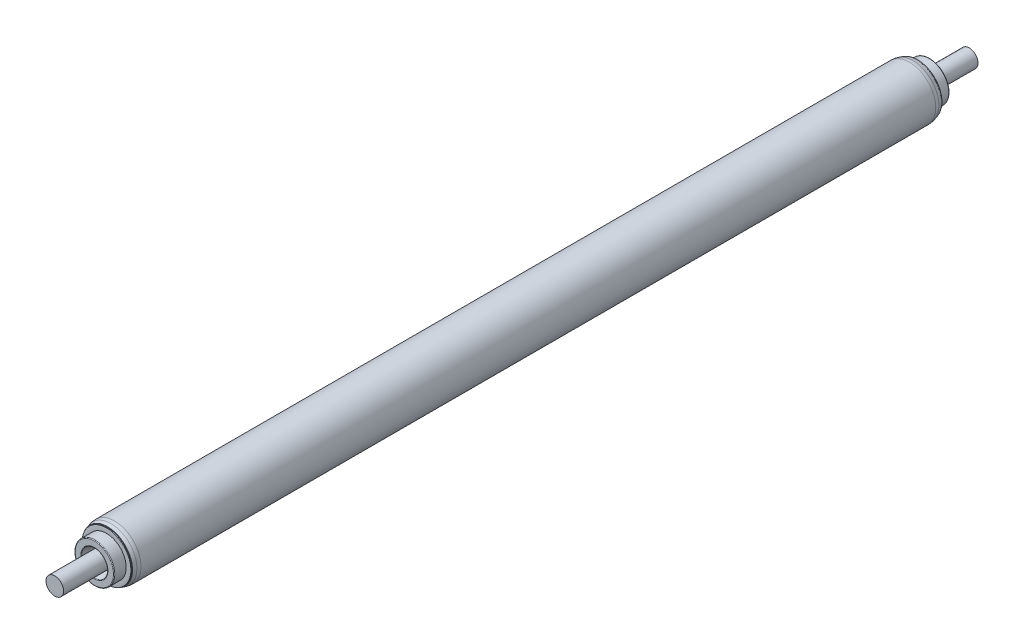
ISO-10303-21;
HEADER;
FILE_DESCRIPTION(('STEP AP214'),'2;1');
FILE_NAME('part.step','',(''),(''),'','','');
FILE_SCHEMA(('AUTOMOTIVE_DESIGN { 1 0 10303 214 1 1 1 1 }'));
ENDSEC;
DATA;
#1=APPLICATION_CONTEXT('core data for automotive mechanical design processes');
#2=APPLICATION_PROTOCOL_DEFINITION('international standard','automotive_design',2000,#1);
#3=PRODUCT_CONTEXT('',#1,'mechanical');
#4=PRODUCT('Part','Part','',(#3));
#5=PRODUCT_RELATED_PRODUCT_CATEGORY('part','',(#4));
#6=PRODUCT_DEFINITION_FORMATION('','',#4);
#7=PRODUCT_DEFINITION_CONTEXT('part definition',#1,'design');
#8=PRODUCT_DEFINITION('design','',#6,#7);
#9=PRODUCT_DEFINITION_SHAPE('','',#8);
#10=(LENGTH_UNIT() NAMED_UNIT(*) SI_UNIT(.MILLI.,.METRE.));
#11=(NAMED_UNIT(*) PLANE_ANGLE_UNIT() SI_UNIT($,.RADIAN.));
#12=(NAMED_UNIT(*) SI_UNIT($,.STERADIAN.) SOLID_ANGLE_UNIT());
#13=UNCERTAINTY_MEASURE_WITH_UNIT(LENGTH_MEASURE(1.E-05),#10,'distance_accuracy_value','');
#14=(GEOMETRIC_REPRESENTATION_CONTEXT(3) GLOBAL_UNCERTAINTY_ASSIGNED_CONTEXT((#13)) GLOBAL_UNIT_ASSIGNED_CONTEXT((#10,
#11,#12)) REPRESENTATION_CONTEXT('',''));
#15=CARTESIAN_POINT('',(0.,0.,0.));
#16=DIRECTION('',(0.,0.,1.));
#17=DIRECTION('',(1.,0.,0.));
#18=AXIS2_PLACEMENT_3D('',#15,#16,#17);
#19=CARTESIAN_POINT('',(0.,0.,-141.996100111103));
#20=DIRECTION('',(0.,0.,-1.));
#21=DIRECTION('',(1.,0.,0.));
#22=AXIS2_PLACEMENT_3D('',#19,#20,#21);
#23=TOROIDAL_SURFACE('',#22,4.42455553068771,2.53999999999998);
#24=CARTESIAN_POINT('',(0.,0.,-144.497511803754));
#25=DIRECTION('',(0.,0.,1.));
#26=DIRECTION('',(1.,0.,0.));
#27=AXIS2_PLACEMENT_3D('',#24,#25,#26);
#28=CIRCLE('',#27,4.86562190196167);
#29=CARTESIAN_POINT('',(4.86562190196167,0.,-144.497511803754));
#30=VERTEX_POINT('',#29);
#31=EDGE_CURVE('E64',#30,#30,#28,.T.);
#32=ORIENTED_EDGE('',*,*,#31,.F.);
#33=EDGE_LOOP('',(#32));
#34=FACE_BOUND('',#33,.T.);
#35=CARTESIAN_POINT('',(0.,0.,-143.266100111103));
#36=DIRECTION('',(0.,0.,1.));
#37=DIRECTION('',(1.,0.,0.));
#38=AXIS2_PLACEMENT_3D('',#35,#36,#37);
#39=CIRCLE('',#38,6.62426005630018);
#40=CARTESIAN_POINT('',(6.62426005630018,0.,-143.266100111103));
#41=VERTEX_POINT('',#40);
#42=EDGE_CURVE('E11',#41,#41,#39,.T.);
#43=ORIENTED_EDGE('',*,*,#42,.T.);
#44=EDGE_LOOP('',(#43));
#45=FACE_BOUND('',#44,.T.);
#46=ADVANCED_FACE('F50',(#34,#45),#23,.F.);
#47=CARTESIAN_POINT('',(0.,0.,-142.038561160277));
#48=DIRECTION('',(0.,0.,1.));
#49=DIRECTION('',(-1.,0.,0.));
#50=AXIS2_PLACEMENT_3D('',#47,#48,#49);
#51=CONICAL_SURFACE('',#50,7.33297999999998,0.523598775598313);
#52=ORIENTED_EDGE('',*,*,#42,.F.);
#53=EDGE_LOOP('',(#52));
#54=FACE_BOUND('',#53,.T.);
#55=CARTESIAN_POINT('',(0.,0.,-142.038561160277));
#56=DIRECTION('',(0.,0.,1.));
#57=DIRECTION('',(1.,0.,0.));
#58=AXIS2_PLACEMENT_3D('',#55,#56,#57);
#59=CIRCLE('',#58,7.33297999999998);
#60=CARTESIAN_POINT('',(7.33297999999998,0.,-142.038561160277));
#61=VERTEX_POINT('',#60);
#62=EDGE_CURVE('E56',#61,#61,#59,.T.);
#63=ORIENTED_EDGE('',*,*,#62,.T.);
#64=EDGE_LOOP('',(#63));
#65=FACE_BOUND('',#64,.T.);
#66=ADVANCED_FACE('F73',(#54,#65),#51,.F.);
#67=CARTESIAN_POINT('',(0.,0.,-152.4));
#68=DIRECTION('',(0.,0.,-1.));
#69=DIRECTION('',(1.,0.,0.));
#70=AXIS2_PLACEMENT_3D('',#67,#68,#69);
#71=CYLINDRICAL_SURFACE('',#70,7.33297999999998);
#72=ORIENTED_EDGE('',*,*,#62,.F.);
#73=EDGE_LOOP('',(#72));
#74=FACE_BOUND('',#73,.T.);
#75=CARTESIAN_POINT('',(0.,0.,-144.06245));
#76=DIRECTION('',(0.,0.,1.));
#77=DIRECTION('',(1.,0.,0.));
#78=AXIS2_PLACEMENT_3D('',#75,#76,#77);
#79=CIRCLE('',#78,7.33297999999998);
#80=CARTESIAN_POINT('',(7.33297999999998,0.,-144.06245));
#81=VERTEX_POINT('',#80);
#82=EDGE_CURVE('E60',#81,#81,#79,.T.);
#83=ORIENTED_EDGE('',*,*,#82,.T.);
#84=EDGE_LOOP('',(#83));
#85=FACE_BOUND('',#84,.T.);
#86=ADVANCED_FACE('F77',(#74,#85),#71,.T.);
#87=CARTESIAN_POINT('',(0.,0.,-144.497511803754));
#88=DIRECTION('',(0.,0.,1.));
#89=DIRECTION('',(-1.,0.,0.));
#90=AXIS2_PLACEMENT_3D('',#87,#88,#89);
#91=CONICAL_SURFACE('',#90,4.86562190196167,1.39626340159548);
#92=ORIENTED_EDGE('',*,*,#82,.F.);
#93=EDGE_LOOP('',(#92));
#94=FACE_BOUND('',#93,.T.);
#95=ORIENTED_EDGE('',*,*,#31,.T.);
#96=EDGE_LOOP('',(#95));
#97=FACE_BOUND('',#96,.T.);
#98=ADVANCED_FACE('F70',(#94,#97),#91,.T.);
#99=CLOSED_SHELL('',(#46,#66,#86,#98));
#100=MANIFOLD_SOLID_BREP('B2',#99);
#101=CARTESIAN_POINT('',(0.,0.,-136.296399999997));
#102=DIRECTION('',(0.,0.,-1.));
#103=DIRECTION('',(1.,0.,0.));
#104=AXIS2_PLACEMENT_3D('',#101,#102,#103);
#105=DEGENERATE_TOROIDAL_SURFACE('',#104,7.80097525196283,10.1854000000028,.T.);
#106=CARTESIAN_POINT('',(0.,0.,-146.431));
#107=DIRECTION('',(0.,0.,1.));
#108=DIRECTION('',(1.,0.,0.));
#109=AXIS2_PLACEMENT_3D('',#106,#107,#108);
#110=CIRCLE('',#109,6.78497525196296);
#111=CARTESIAN_POINT('',(6.78497525196296,0.,-146.431));
#112=VERTEX_POINT('',#111);
#113=EDGE_CURVE('E49',#112,#112,#110,.T.);
#114=ORIENTED_EDGE('',*,*,#113,.T.);
#115=EDGE_LOOP('',(#114));
#116=FACE_BOUND('',#115,.T.);
#117=CARTESIAN_POINT('',(0.,0.,-146.431));
#118=DIRECTION('',(0.,0.,1.));
#119=DIRECTION('',(1.,0.,0.));
#120=AXIS2_PLACEMENT_3D('',#117,#118,#119);
#121=CIRCLE('',#120,8.81697525196297);
#122=CARTESIAN_POINT('',(8.81697525196297,0.,-146.431));
#123=VERTEX_POINT('',#122);
#124=EDGE_CURVE('E159',#123,#123,#121,.T.);
#125=ORIENTED_EDGE('',*,*,#124,.F.);
#126=EDGE_LOOP('',(#125));
#127=FACE_BOUND('',#126,.T.);
#128=ADVANCED_FACE('F128',(#116,#127),#105,.T.);
#129=CARTESIAN_POINT('',(0.,0.,-144.239356490816));
#130=DIRECTION('',(0.,0.,-1.));
#131=DIRECTION('',(1.,0.,0.));
#132=AXIS2_PLACEMENT_3D('',#129,#130,#131);
#133=TOROIDAL_SURFACE('',#132,5.5011143838584,2.54);
#134=CARTESIAN_POINT('',(0.,0.,-143.798290119542));
#135=DIRECTION('',(0.,0.,1.));
#136=DIRECTION('',(1.,0.,0.));
#137=AXIS2_PLACEMENT_3D('',#134,#135,#136);
#138=CIRCLE('',#137,8.0025260765094);
#139=CARTESIAN_POINT('',(8.0025260765094,0.,-143.798290119542));
#140=VERTEX_POINT('',#139);
#141=EDGE_CURVE('E134',#140,#140,#138,.T.);
#142=ORIENTED_EDGE('',*,*,#141,.T.);
#143=EDGE_LOOP('',(#142));
#144=FACE_BOUND('',#143,.T.);
#145=ORIENTED_EDGE('',*,*,#113,.F.);
#146=EDGE_LOOP('',(#145));
#147=FACE_BOUND('',#146,.T.);
#148=ADVANCED_FACE('F167',(#144,#147),#133,.F.);
#149=CARTESIAN_POINT('',(0.,0.,-143.798290119542));
#150=DIRECTION('',(0.,0.,-1.));
#151=DIRECTION('',(1.,0.,0.));
#152=AXIS2_PLACEMENT_3D('',#149,#150,#151);
#153=CONICAL_SURFACE('',#152,8.0025260765094,0.174532925199429);
#154=CARTESIAN_POINT('',(0.,0.,-141.6939));
#155=DIRECTION('',(0.,0.,1.));
#156=DIRECTION('',(1.,0.,0.));
#157=AXIS2_PLACEMENT_3D('',#154,#155,#156);
#158=CIRCLE('',#157,7.6314653204979);
#159=CARTESIAN_POINT('',(7.6314653204979,0.,-141.6939));
#160=VERTEX_POINT('',#159);
#161=EDGE_CURVE('E138',#160,#160,#158,.T.);
#162=ORIENTED_EDGE('',*,*,#161,.T.);
#163=EDGE_LOOP('',(#162));
#164=FACE_BOUND('',#163,.T.);
#165=ORIENTED_EDGE('',*,*,#141,.F.);
#166=EDGE_LOOP('',(#165));
#167=FACE_BOUND('',#166,.T.);
#168=ADVANCED_FACE('F171',(#164,#167),#153,.F.);
#169=CARTESIAN_POINT('',(0.,7.63146532049791,-141.6939));
#170=DIRECTION('',(0.,0.,1.));
#171=DIRECTION('',(-1.,0.,0.));
#172=AXIS2_PLACEMENT_3D('',#169,#170,#171);
#173=PLANE('',#172);
#174=CARTESIAN_POINT('',(0.,0.,-141.6939));
#175=DIRECTION('',(0.,0.,1.));
#176=DIRECTION('',(1.,0.,0.));
#177=AXIS2_PLACEMENT_3D('',#174,#175,#176);
#178=CIRCLE('',#177,7.14247999999998);
#179=CARTESIAN_POINT('',(7.14247999999998,0.,-141.6939));
#180=VERTEX_POINT('',#179);
#181=EDGE_CURVE('E142',#180,#180,#178,.T.);
#182=ORIENTED_EDGE('',*,*,#181,.T.);
#183=EDGE_LOOP('',(#182));
#184=FACE_BOUND('',#183,.T.);
#185=ORIENTED_EDGE('',*,*,#161,.F.);
#186=EDGE_LOOP('',(#185));
#187=FACE_BOUND('',#186,.T.);
#188=ADVANCED_FACE('F175',(#184,#187),#173,.F.);
#189=CARTESIAN_POINT('',(0.,0.,-152.4));
#190=DIRECTION('',(0.,0.,-1.));
#191=DIRECTION('',(1.,0.,0.));
#192=AXIS2_PLACEMENT_3D('',#189,#190,#191);
#193=CYLINDRICAL_SURFACE('',#192,7.14247999999998);
#194=CARTESIAN_POINT('',(0.,0.,-140.0175));
#195=DIRECTION('',(0.,0.,1.));
#196=DIRECTION('',(1.,0.,0.));
#197=AXIS2_PLACEMENT_3D('',#194,#195,#196);
#198=CIRCLE('',#197,7.14247999999998);
#199=CARTESIAN_POINT('',(7.14247999999998,0.,-140.0175));
#200=VERTEX_POINT('',#199);
#201=EDGE_CURVE('E147',#200,#200,#198,.T.);
#202=ORIENTED_EDGE('',*,*,#201,.T.);
#203=EDGE_LOOP('',(#202));
#204=FACE_BOUND('',#203,.T.);
#205=ORIENTED_EDGE('',*,*,#181,.F.);
#206=EDGE_LOOP('',(#205));
#207=FACE_BOUND('',#206,.T.);
#208=ADVANCED_FACE('F182',(#204,#207),#193,.F.);
#209=CARTESIAN_POINT('',(0.,7.72274830916671,-140.0175));
#210=DIRECTION('',(0.,0.,-1.));
#211=DIRECTION('',(1.,0.,0.));
#212=AXIS2_PLACEMENT_3D('',#209,#210,#211);
#213=PLANE('',#212);
#214=CARTESIAN_POINT('',(0.,0.,-140.0175));
#215=DIRECTION('',(0.,0.,1.));
#216=DIRECTION('',(1.,0.,0.));
#217=AXIS2_PLACEMENT_3D('',#214,#215,#216);
#218=CIRCLE('',#217,7.7227483091667);
#219=CARTESIAN_POINT('',(7.7227483091667,0.,-140.0175));
#220=VERTEX_POINT('',#219);
#221=EDGE_CURVE('E150',#220,#220,#218,.T.);
#222=ORIENTED_EDGE('',*,*,#221,.T.);
#223=EDGE_LOOP('',(#222));
#224=FACE_BOUND('',#223,.T.);
#225=ORIENTED_EDGE('',*,*,#201,.F.);
#226=EDGE_LOOP('',(#225));
#227=FACE_BOUND('',#226,.T.);
#228=ADVANCED_FACE('F186',(#224,#227),#213,.F.);
#229=CARTESIAN_POINT('',(0.,0.,-140.0175));
#230=DIRECTION('',(0.,0.,-1.));
#231=DIRECTION('',(1.,0.,0.));
#232=AXIS2_PLACEMENT_3D('',#229,#230,#231);
#233=CONICAL_SURFACE('',#232,7.7227483091667,0.174532925199432);
#234=CARTESIAN_POINT('',(0.,0.,-146.177));
#235=DIRECTION('',(0.,0.,1.));
#236=DIRECTION('',(1.,0.,0.));
#237=AXIS2_PLACEMENT_3D('',#234,#235,#236);
#238=CIRCLE('',#237,8.80883434684047);
#239=CARTESIAN_POINT('',(8.80883434684047,0.,-146.177));
#240=VERTEX_POINT('',#239);
#241=EDGE_CURVE('E153',#240,#240,#238,.T.);
#242=ORIENTED_EDGE('',*,*,#241,.T.);
#243=EDGE_LOOP('',(#242));
#244=FACE_BOUND('',#243,.T.);
#245=ORIENTED_EDGE('',*,*,#221,.F.);
#246=EDGE_LOOP('',(#245));
#247=FACE_BOUND('',#246,.T.);
#248=ADVANCED_FACE('F190',(#244,#247),#233,.T.);
#249=CARTESIAN_POINT('',(0.,8.80883434684048,-146.177));
#250=DIRECTION('',(0.,0.,-1.));
#251=DIRECTION('',(1.,0.,0.));
#252=AXIS2_PLACEMENT_3D('',#249,#250,#251);
#253=PLANE('',#252);
#254=CARTESIAN_POINT('',(0.,0.,-146.177));
#255=DIRECTION('',(0.,0.,1.));
#256=DIRECTION('',(1.,0.,0.));
#257=AXIS2_PLACEMENT_3D('',#254,#255,#256);
#258=CIRCLE('',#257,8.88503434684048);
#259=CARTESIAN_POINT('',(8.88503434684048,0.,-146.177));
#260=VERTEX_POINT('',#259);
#261=EDGE_CURVE('E156',#260,#260,#258,.T.);
#262=ORIENTED_EDGE('',*,*,#261,.T.);
#263=EDGE_LOOP('',(#262));
#264=FACE_BOUND('',#263,.T.);
#265=ORIENTED_EDGE('',*,*,#241,.F.);
#266=EDGE_LOOP('',(#265));
#267=FACE_BOUND('',#266,.T.);
#268=ADVANCED_FACE('F194',(#264,#267),#253,.F.);
#269=CARTESIAN_POINT('',(0.,0.,-146.177));
#270=DIRECTION('',(0.,0.,1.));
#271=DIRECTION('',(-1.,0.,0.));
#272=AXIS2_PLACEMENT_3D('',#269,#270,#271);
#273=CONICAL_SURFACE('',#272,8.88503434684048,0.261799387799154);
#274=ORIENTED_EDGE('',*,*,#124,.T.);
#275=EDGE_LOOP('',(#274));
#276=FACE_BOUND('',#275,.T.);
#277=ORIENTED_EDGE('',*,*,#261,.F.);
#278=EDGE_LOOP('',(#277));
#279=FACE_BOUND('',#278,.T.);
#280=ADVANCED_FACE('F163',(#276,#279),#273,.T.);
#281=CLOSED_SHELL('',(#128,#148,#168,#188,#208,#228,#248,#268,#280));
#282=MANIFOLD_SOLID_BREP('B6',#281);
#283=CARTESIAN_POINT('',(0.,-3.17499999999999,-138.1125));
#284=DIRECTION('',(0.,0.,1.));
#285=DIRECTION('',(0.,1.,0.));
#286=AXIS2_PLACEMENT_3D('',#283,#284,#285);
#287=PLANE('',#286);
#288=CARTESIAN_POINT('',(0.,0.,-138.1125));
#289=DIRECTION('',(0.,0.,1.));
#290=DIRECTION('',(0.,-1.,0.));
#291=AXIS2_PLACEMENT_3D('',#288,#289,#290);
#292=CIRCLE('',#291,3.17499999999999);
#293=CARTESIAN_POINT('',(0.,-3.17499999999999,-138.1125));
#294=VERTEX_POINT('',#293);
#295=EDGE_CURVE('E316',#294,#294,#292,.T.);
#296=ORIENTED_EDGE('',*,*,#295,.F.);
#297=EDGE_LOOP('',(#296));
#298=FACE_BOUND('',#297,.T.);
#299=CARTESIAN_POINT('',(0.,0.,-138.1125));
#300=DIRECTION('',(0.,0.,1.));
#301=DIRECTION('',(0.,-1.,0.));
#302=AXIS2_PLACEMENT_3D('',#299,#300,#301);
#303=CIRCLE('',#302,7.14247999999998);
#304=CARTESIAN_POINT('',(0.,-7.14247999999997,-138.1125));
#305=VERTEX_POINT('',#304);
#306=EDGE_CURVE('E127',#305,#305,#303,.T.);
#307=ORIENTED_EDGE('',*,*,#306,.T.);
#308=EDGE_LOOP('',(#307));
#309=FACE_BOUND('',#308,.T.);
#310=ADVANCED_FACE('F291',(#298,#309),#287,.T.);
#311=CARTESIAN_POINT('',(0.,0.,-165.1));
#312=DIRECTION('',(0.,0.,-1.));
#313=DIRECTION('',(0.,-1.,0.));
#314=AXIS2_PLACEMENT_3D('',#311,#312,#313);
#315=CYLINDRICAL_SURFACE('',#314,7.14247999999998);
#316=ORIENTED_EDGE('',*,*,#306,.F.);
#317=EDGE_LOOP('',(#316));
#318=FACE_BOUND('',#317,.T.);
#319=CARTESIAN_POINT('',(0.,0.,-150.5585));
#320=DIRECTION('',(0.,0.,1.));
#321=DIRECTION('',(0.,-1.,0.));
#322=AXIS2_PLACEMENT_3D('',#319,#320,#321);
#323=CIRCLE('',#322,7.14247999999998);
#324=CARTESIAN_POINT('',(0.,-7.14247999999997,-150.5585));
#325=VERTEX_POINT('',#324);
#326=EDGE_CURVE('E297',#325,#325,#323,.T.);
#327=ORIENTED_EDGE('',*,*,#326,.T.);
#328=EDGE_LOOP('',(#327));
#329=FACE_BOUND('',#328,.T.);
#330=ADVANCED_FACE('F323',(#318,#329),#315,.T.);
#331=CARTESIAN_POINT('',(0.,0.,-150.5585));
#332=DIRECTION('',(0.,0.,-1.));
#333=DIRECTION('',(0.,-1.,0.));
#334=AXIS2_PLACEMENT_3D('',#331,#332,#333);
#335=TOROIDAL_SURFACE('',#334,6.88847999999998,0.254000000000002);
#336=ORIENTED_EDGE('',*,*,#326,.F.);
#337=EDGE_LOOP('',(#336));
#338=FACE_BOUND('',#337,.T.);
#339=CARTESIAN_POINT('',(0.,0.,-150.8125));
#340=DIRECTION('',(0.,0.,1.));
#341=DIRECTION('',(0.,-1.,0.));
#342=AXIS2_PLACEMENT_3D('',#339,#340,#341);
#343=CIRCLE('',#342,6.88847999999998);
#344=CARTESIAN_POINT('',(0.,-6.88847999999997,-150.8125));
#345=VERTEX_POINT('',#344);
#346=EDGE_CURVE('E301',#345,#345,#343,.T.);
#347=ORIENTED_EDGE('',*,*,#346,.T.);
#348=EDGE_LOOP('',(#347));
#349=FACE_BOUND('',#348,.T.);
#350=ADVANCED_FACE('F327',(#338,#349),#335,.T.);
#351=CARTESIAN_POINT('',(0.,-6.88847999999997,-150.8125));
#352=DIRECTION('',(0.,0.,-1.));
#353=DIRECTION('',(0.,-1.,0.));
#354=AXIS2_PLACEMENT_3D('',#351,#352,#353);
#355=PLANE('',#354);
#356=ORIENTED_EDGE('',*,*,#346,.F.);
#357=EDGE_LOOP('',(#356));
#358=FACE_BOUND('',#357,.T.);
#359=CARTESIAN_POINT('',(0.,0.,-150.8125));
#360=DIRECTION('',(0.,0.,1.));
#361=DIRECTION('',(0.,-1.,0.));
#362=AXIS2_PLACEMENT_3D('',#359,#360,#361);
#363=CIRCLE('',#362,4.91588804801143);
#364=CARTESIAN_POINT('',(0.,-4.91588804801142,-150.8125));
#365=VERTEX_POINT('',#364);
#366=EDGE_CURVE('E305',#365,#365,#363,.T.);
#367=ORIENTED_EDGE('',*,*,#366,.T.);
#368=EDGE_LOOP('',(#367));
#369=FACE_BOUND('',#368,.T.);
#370=ADVANCED_FACE('F332',(#358,#369),#355,.T.);
#371=CARTESIAN_POINT('',(0.,0.,-150.5585));
#372=DIRECTION('',(0.,0.,-1.));
#373=DIRECTION('',(0.,-1.,0.));
#374=AXIS2_PLACEMENT_3D('',#371,#372,#373);
#375=TOROIDAL_SURFACE('',#374,4.91588804801143,0.254000000000029);
#376=ORIENTED_EDGE('',*,*,#366,.F.);
#377=EDGE_LOOP('',(#376));
#378=FACE_BOUND('',#377,.T.);
#379=CARTESIAN_POINT('',(0.,0.,-150.675449640288));
#380=DIRECTION('',(0.,0.,1.));
#381=DIRECTION('',(0.,-1.,0.));
#382=AXIS2_PLACEMENT_3D('',#379,#380,#381);
#383=CIRCLE('',#382,4.69041347818909);
#384=CARTESIAN_POINT('',(0.,-4.69041347818908,-150.675449640288));
#385=VERTEX_POINT('',#384);
#386=EDGE_CURVE('E310',#385,#385,#383,.T.);
#387=ORIENTED_EDGE('',*,*,#386,.T.);
#388=EDGE_LOOP('',(#387));
#389=FACE_BOUND('',#388,.T.);
#390=ADVANCED_FACE('F338',(#378,#389),#375,.T.);
#391=CARTESIAN_POINT('',(0.,0.,-144.4625));
#392=DIRECTION('',(0.,0.,-1.));
#393=DIRECTION('',(0.,-1.,0.));
#394=AXIS2_PLACEMENT_3D('',#391,#392,#393);
#395=TOROIDAL_SURFACE('',#394,16.66875,13.49375);
#396=ORIENTED_EDGE('',*,*,#386,.F.);
#397=EDGE_LOOP('',(#396));
#398=FACE_BOUND('',#397,.T.);
#399=CARTESIAN_POINT('',(0.,0.,-144.4625));
#400=DIRECTION('',(0.,0.,1.));
#401=DIRECTION('',(0.,-1.,0.));
#402=AXIS2_PLACEMENT_3D('',#399,#400,#401);
#403=CIRCLE('',#402,3.17499999999999);
#404=CARTESIAN_POINT('',(0.,-3.17499999999998,-144.4625));
#405=VERTEX_POINT('',#404);
#406=EDGE_CURVE('E313',#405,#405,#403,.T.);
#407=ORIENTED_EDGE('',*,*,#406,.T.);
#408=EDGE_LOOP('',(#407));
#409=FACE_BOUND('',#408,.T.);
#410=ADVANCED_FACE('F342',(#398,#409),#395,.T.);
#411=CARTESIAN_POINT('',(0.,0.,-165.1));
#412=DIRECTION('',(0.,0.,-1.));
#413=DIRECTION('',(0.,-1.,0.));
#414=AXIS2_PLACEMENT_3D('',#411,#412,#413);
#415=CYLINDRICAL_SURFACE('',#414,3.17499999999999);
#416=ORIENTED_EDGE('',*,*,#406,.F.);
#417=EDGE_LOOP('',(#416));
#418=FACE_BOUND('',#417,.T.);
#419=ORIENTED_EDGE('',*,*,#295,.T.);
#420=EDGE_LOOP('',(#419));
#421=FACE_BOUND('',#420,.T.);
#422=ADVANCED_FACE('F320',(#418,#421),#415,.F.);
#423=CLOSED_SHELL('',(#310,#330,#350,#370,#390,#410,#422));
#424=MANIFOLD_SOLID_BREP('B44',#423);
#425=CARTESIAN_POINT('',(0.,0.,141.996100111103));
#426=DIRECTION('',(0.,0.,1.));
#427=DIRECTION('',(1.,0.,0.));
#428=AXIS2_PLACEMENT_3D('',#425,#426,#427);
#429=TOROIDAL_SURFACE('',#428,4.42455553068771,2.53999999999998);
#430=CARTESIAN_POINT('',(0.,0.,144.497511803754));
#431=DIRECTION('',(0.,0.,1.));
#432=DIRECTION('',(1.,0.,0.));
#433=AXIS2_PLACEMENT_3D('',#430,#431,#432);
#434=CIRCLE('',#433,4.86562190196167);
#435=CARTESIAN_POINT('',(4.86562190196167,0.,144.497511803754));
#436=VERTEX_POINT('',#435);
#437=EDGE_CURVE('E434',#436,#436,#434,.T.);
#438=ORIENTED_EDGE('',*,*,#437,.T.);
#439=EDGE_LOOP('',(#438));
#440=FACE_BOUND('',#439,.T.);
#441=CARTESIAN_POINT('',(0.,0.,143.266100111103));
#442=DIRECTION('',(0.,0.,1.));
#443=DIRECTION('',(1.,0.,0.));
#444=AXIS2_PLACEMENT_3D('',#441,#442,#443);
#445=CIRCLE('',#444,6.62426005630018);
#446=CARTESIAN_POINT('',(6.62426005630018,0.,143.266100111103));
#447=VERTEX_POINT('',#446);
#448=EDGE_CURVE('E290',#447,#447,#445,.T.);
#449=ORIENTED_EDGE('',*,*,#448,.F.);
#450=EDGE_LOOP('',(#449));
#451=FACE_BOUND('',#450,.T.);
#452=ADVANCED_FACE('F420',(#440,#451),#429,.F.);
#453=CARTESIAN_POINT('',(0.,0.,142.038561160277));
#454=DIRECTION('',(0.,0.,-1.));
#455=DIRECTION('',(-1.,0.,0.));
#456=AXIS2_PLACEMENT_3D('',#453,#454,#455);
#457=CONICAL_SURFACE('',#456,7.33297999999998,0.523598775598313);
#458=ORIENTED_EDGE('',*,*,#448,.T.);
#459=EDGE_LOOP('',(#458));
#460=FACE_BOUND('',#459,.T.);
#461=CARTESIAN_POINT('',(0.,0.,142.038561160277));
#462=DIRECTION('',(0.,0.,1.));
#463=DIRECTION('',(1.,0.,0.));
#464=AXIS2_PLACEMENT_3D('',#461,#462,#463);
#465=CIRCLE('',#464,7.33297999999998);
#466=CARTESIAN_POINT('',(7.33297999999998,0.,142.038561160277));
#467=VERTEX_POINT('',#466);
#468=EDGE_CURVE('E426',#467,#467,#465,.T.);
#469=ORIENTED_EDGE('',*,*,#468,.F.);
#470=EDGE_LOOP('',(#469));
#471=FACE_BOUND('',#470,.T.);
#472=ADVANCED_FACE('F450',(#460,#471),#457,.F.);
#473=CARTESIAN_POINT('',(0.,0.,152.4));
#474=DIRECTION('',(0.,0.,1.));
#475=DIRECTION('',(1.,0.,0.));
#476=AXIS2_PLACEMENT_3D('',#473,#474,#475);
#477=CYLINDRICAL_SURFACE('',#476,7.33297999999998);
#478=ORIENTED_EDGE('',*,*,#468,.T.);
#479=EDGE_LOOP('',(#478));
#480=FACE_BOUND('',#479,.T.);
#481=CARTESIAN_POINT('',(0.,0.,144.06245));
#482=DIRECTION('',(0.,0.,1.));
#483=DIRECTION('',(1.,0.,0.));
#484=AXIS2_PLACEMENT_3D('',#481,#482,#483);
#485=CIRCLE('',#484,7.33297999999998);
#486=CARTESIAN_POINT('',(7.33297999999998,0.,144.06245));
#487=VERTEX_POINT('',#486);
#488=EDGE_CURVE('E430',#487,#487,#485,.T.);
#489=ORIENTED_EDGE('',*,*,#488,.F.);
#490=EDGE_LOOP('',(#489));
#491=FACE_BOUND('',#490,.T.);
#492=ADVANCED_FACE('F444',(#480,#491),#477,.T.);
#493=CARTESIAN_POINT('',(0.,0.,144.497511803754));
#494=DIRECTION('',(0.,0.,-1.));
#495=DIRECTION('',(-1.,0.,0.));
#496=AXIS2_PLACEMENT_3D('',#493,#494,#495);
#497=CONICAL_SURFACE('',#496,4.86562190196167,1.39626340159548);
#498=ORIENTED_EDGE('',*,*,#488,.T.);
#499=EDGE_LOOP('',(#498));
#500=FACE_BOUND('',#499,.T.);
#501=ORIENTED_EDGE('',*,*,#437,.F.);
#502=EDGE_LOOP('',(#501));
#503=FACE_BOUND('',#502,.T.);
#504=ADVANCED_FACE('F442',(#500,#503),#497,.T.);
#505=CLOSED_SHELL('',(#452,#472,#492,#504));
#506=MANIFOLD_SOLID_BREP('B122',#505);
#507=CARTESIAN_POINT('',(0.,0.,136.296399999997));
#508=DIRECTION('',(0.,0.,1.));
#509=DIRECTION('',(1.,0.,0.));
#510=AXIS2_PLACEMENT_3D('',#507,#508,#509);
#511=DEGENERATE_TOROIDAL_SURFACE('',#510,7.80097525196283,10.1854000000028,.T.);
#512=CARTESIAN_POINT('',(0.,0.,146.431));
#513=DIRECTION('',(0.,0.,1.));
#514=DIRECTION('',(1.,0.,0.));
#515=AXIS2_PLACEMENT_3D('',#512,#513,#514);
#516=CIRCLE('',#515,6.78497525196296);
#517=CARTESIAN_POINT('',(6.78497525196296,0.,146.431));
#518=VERTEX_POINT('',#517);
#519=EDGE_CURVE('E419',#518,#518,#516,.T.);
#520=ORIENTED_EDGE('',*,*,#519,.F.);
#521=EDGE_LOOP('',(#520));
#522=FACE_BOUND('',#521,.T.);
#523=CARTESIAN_POINT('',(0.,0.,146.431));
#524=DIRECTION('',(0.,0.,1.));
#525=DIRECTION('',(1.,0.,0.));
#526=AXIS2_PLACEMENT_3D('',#523,#524,#525);
#527=CIRCLE('',#526,8.81697525196297);
#528=CARTESIAN_POINT('',(8.81697525196297,0.,146.431));
#529=VERTEX_POINT('',#528);
#530=EDGE_CURVE('E529',#529,#529,#527,.T.);
#531=ORIENTED_EDGE('',*,*,#530,.T.);
#532=EDGE_LOOP('',(#531));
#533=FACE_BOUND('',#532,.T.);
#534=ADVANCED_FACE('F498',(#522,#533),#511,.T.);
#535=CARTESIAN_POINT('',(0.,0.,144.239356490816));
#536=DIRECTION('',(0.,0.,1.));
#537=DIRECTION('',(1.,0.,0.));
#538=AXIS2_PLACEMENT_3D('',#535,#536,#537);
#539=TOROIDAL_SURFACE('',#538,5.5011143838584,2.54);
#540=CARTESIAN_POINT('',(0.,0.,143.798290119542));
#541=DIRECTION('',(0.,0.,1.));
#542=DIRECTION('',(1.,0.,0.));
#543=AXIS2_PLACEMENT_3D('',#540,#541,#542);
#544=CIRCLE('',#543,8.0025260765094);
#545=CARTESIAN_POINT('',(8.0025260765094,0.,143.798290119542));
#546=VERTEX_POINT('',#545);
#547=EDGE_CURVE('E504',#546,#546,#544,.T.);
#548=ORIENTED_EDGE('',*,*,#547,.F.);
#549=EDGE_LOOP('',(#548));
#550=FACE_BOUND('',#549,.T.);
#551=ORIENTED_EDGE('',*,*,#519,.T.);
#552=EDGE_LOOP('',(#551));
#553=FACE_BOUND('',#552,.T.);
#554=ADVANCED_FACE('F572',(#550,#553),#539,.F.);
#555=CARTESIAN_POINT('',(0.,0.,143.798290119542));
#556=DIRECTION('',(0.,0.,1.));
#557=DIRECTION('',(1.,0.,0.));
#558=AXIS2_PLACEMENT_3D('',#555,#556,#557);
#559=CONICAL_SURFACE('',#558,8.0025260765094,0.174532925199429);
#560=CARTESIAN_POINT('',(0.,0.,141.6939));
#561=DIRECTION('',(0.,0.,1.));
#562=DIRECTION('',(1.,0.,0.));
#563=AXIS2_PLACEMENT_3D('',#560,#561,#562);
#564=CIRCLE('',#563,7.6314653204979);
#565=CARTESIAN_POINT('',(7.6314653204979,0.,141.6939));
#566=VERTEX_POINT('',#565);
#567=EDGE_CURVE('E508',#566,#566,#564,.T.);
#568=ORIENTED_EDGE('',*,*,#567,.F.);
#569=EDGE_LOOP('',(#568));
#570=FACE_BOUND('',#569,.T.);
#571=ORIENTED_EDGE('',*,*,#547,.T.);
#572=EDGE_LOOP('',(#571));
#573=FACE_BOUND('',#572,.T.);
#574=ADVANCED_FACE('F567',(#570,#573),#559,.F.);
#575=CARTESIAN_POINT('',(0.,7.63146532049791,141.6939));
#576=DIRECTION('',(0.,0.,-1.));
#577=DIRECTION('',(-1.,0.,0.));
#578=AXIS2_PLACEMENT_3D('',#575,#576,#577);
#579=PLANE('',#578);
#580=CARTESIAN_POINT('',(0.,0.,141.6939));
#581=DIRECTION('',(0.,0.,1.));
#582=DIRECTION('',(1.,0.,0.));
#583=AXIS2_PLACEMENT_3D('',#580,#581,#582);
#584=CIRCLE('',#583,7.14247999999998);
#585=CARTESIAN_POINT('',(7.14247999999998,0.,141.6939));
#586=VERTEX_POINT('',#585);
#587=EDGE_CURVE('E512',#586,#586,#584,.T.);
#588=ORIENTED_EDGE('',*,*,#587,.F.);
#589=EDGE_LOOP('',(#588));
#590=FACE_BOUND('',#589,.T.);
#591=ORIENTED_EDGE('',*,*,#567,.T.);
#592=EDGE_LOOP('',(#591));
#593=FACE_BOUND('',#592,.T.);
#594=ADVANCED_FACE('F561',(#590,#593),#579,.F.);
#595=CARTESIAN_POINT('',(0.,0.,152.4));
#596=DIRECTION('',(0.,0.,1.));
#597=DIRECTION('',(1.,0.,0.));
#598=AXIS2_PLACEMENT_3D('',#595,#596,#597);
#599=CYLINDRICAL_SURFACE('',#598,7.14247999999998);
#600=CARTESIAN_POINT('',(0.,0.,140.0175));
#601=DIRECTION('',(0.,0.,1.));
#602=DIRECTION('',(1.,0.,0.));
#603=AXIS2_PLACEMENT_3D('',#600,#601,#602);
#604=CIRCLE('',#603,7.14247999999998);
#605=CARTESIAN_POINT('',(7.14247999999998,0.,140.0175));
#606=VERTEX_POINT('',#605);
#607=EDGE_CURVE('E517',#606,#606,#604,.T.);
#608=ORIENTED_EDGE('',*,*,#607,.F.);
#609=EDGE_LOOP('',(#608));
#610=FACE_BOUND('',#609,.T.);
#611=ORIENTED_EDGE('',*,*,#587,.T.);
#612=EDGE_LOOP('',(#611));
#613=FACE_BOUND('',#612,.T.);
#614=ADVANCED_FACE('F555',(#610,#613),#599,.F.);
#615=CARTESIAN_POINT('',(0.,7.72274830916671,140.0175));
#616=DIRECTION('',(0.,0.,1.));
#617=DIRECTION('',(1.,0.,0.));
#618=AXIS2_PLACEMENT_3D('',#615,#616,#617);
#619=PLANE('',#618);
#620=CARTESIAN_POINT('',(0.,0.,140.0175));
#621=DIRECTION('',(0.,0.,1.));
#622=DIRECTION('',(1.,0.,0.));
#623=AXIS2_PLACEMENT_3D('',#620,#621,#622);
#624=CIRCLE('',#623,7.7227483091667);
#625=CARTESIAN_POINT('',(7.7227483091667,0.,140.0175));
#626=VERTEX_POINT('',#625);
#627=EDGE_CURVE('E520',#626,#626,#624,.T.);
#628=ORIENTED_EDGE('',*,*,#627,.F.);
#629=EDGE_LOOP('',(#628));
#630=FACE_BOUND('',#629,.T.);
#631=ORIENTED_EDGE('',*,*,#607,.T.);
#632=EDGE_LOOP('',(#631));
#633=FACE_BOUND('',#632,.T.);
#634=ADVANCED_FACE('F549',(#630,#633),#619,.F.);
#635=CARTESIAN_POINT('',(0.,0.,140.0175));
#636=DIRECTION('',(0.,0.,1.));
#637=DIRECTION('',(1.,0.,0.));
#638=AXIS2_PLACEMENT_3D('',#635,#636,#637);
#639=CONICAL_SURFACE('',#638,7.7227483091667,0.174532925199432);
#640=CARTESIAN_POINT('',(0.,0.,146.177));
#641=DIRECTION('',(0.,0.,1.));
#642=DIRECTION('',(1.,0.,0.));
#643=AXIS2_PLACEMENT_3D('',#640,#641,#642);
#644=CIRCLE('',#643,8.80883434684047);
#645=CARTESIAN_POINT('',(8.80883434684047,0.,146.177));
#646=VERTEX_POINT('',#645);
#647=EDGE_CURVE('E523',#646,#646,#644,.T.);
#648=ORIENTED_EDGE('',*,*,#647,.F.);
#649=EDGE_LOOP('',(#648));
#650=FACE_BOUND('',#649,.T.);
#651=ORIENTED_EDGE('',*,*,#627,.T.);
#652=EDGE_LOOP('',(#651));
#653=FACE_BOUND('',#652,.T.);
#654=ADVANCED_FACE('F543',(#650,#653),#639,.T.);
#655=CARTESIAN_POINT('',(0.,8.80883434684048,146.177));
#656=DIRECTION('',(0.,0.,1.));
#657=DIRECTION('',(1.,0.,0.));
#658=AXIS2_PLACEMENT_3D('',#655,#656,#657);
#659=PLANE('',#658);
#660=CARTESIAN_POINT('',(0.,0.,146.177));
#661=DIRECTION('',(0.,0.,1.));
#662=DIRECTION('',(1.,0.,0.));
#663=AXIS2_PLACEMENT_3D('',#660,#661,#662);
#664=CIRCLE('',#663,8.88503434684048);
#665=CARTESIAN_POINT('',(8.88503434684048,0.,146.177));
#666=VERTEX_POINT('',#665);
#667=EDGE_CURVE('E526',#666,#666,#664,.T.);
#668=ORIENTED_EDGE('',*,*,#667,.F.);
#669=EDGE_LOOP('',(#668));
#670=FACE_BOUND('',#669,.T.);
#671=ORIENTED_EDGE('',*,*,#647,.T.);
#672=EDGE_LOOP('',(#671));
#673=FACE_BOUND('',#672,.T.);
#674=ADVANCED_FACE('F537',(#670,#673),#659,.F.);
#675=CARTESIAN_POINT('',(0.,0.,146.177));
#676=DIRECTION('',(0.,0.,-1.));
#677=DIRECTION('',(-1.,0.,0.));
#678=AXIS2_PLACEMENT_3D('',#675,#676,#677);
#679=CONICAL_SURFACE('',#678,8.88503434684048,0.261799387799154);
#680=ORIENTED_EDGE('',*,*,#530,.F.);
#681=EDGE_LOOP('',(#680));
#682=FACE_BOUND('',#681,.T.);
#683=ORIENTED_EDGE('',*,*,#667,.T.);
#684=EDGE_LOOP('',(#683));
#685=FACE_BOUND('',#684,.T.);
#686=ADVANCED_FACE('F534',(#682,#685),#679,.T.);
#687=CLOSED_SHELL('',(#534,#554,#574,#594,#614,#634,#654,#674,#686));
#688=MANIFOLD_SOLID_BREP('B285',#687);
#689=CARTESIAN_POINT('',(0.,9.017,146.05));
#690=DIRECTION('',(0.,0.,-1.));
#691=DIRECTION('',(-1.,0.,0.));
#692=AXIS2_PLACEMENT_3D('',#689,#690,#691);
#693=PLANE('',#692);
#694=CARTESIAN_POINT('',(0.,0.,146.05));
#695=DIRECTION('',(0.,0.,1.));
#696=DIRECTION('',(1.,0.,0.));
#697=AXIS2_PLACEMENT_3D('',#694,#695,#696);
#698=CIRCLE('',#697,8.91539999999999);
#699=CARTESIAN_POINT('',(8.91539999999999,0.,146.05));
#700=VERTEX_POINT('',#699);
#701=EDGE_CURVE('E497',#700,#700,#698,.T.);
#702=ORIENTED_EDGE('',*,*,#701,.F.);
#703=EDGE_LOOP('',(#702));
#704=FACE_BOUND('',#703,.T.);
#705=CARTESIAN_POINT('',(0.,0.,146.05));
#706=DIRECTION('',(0.,0.,1.));
#707=DIRECTION('',(1.,0.,0.));
#708=AXIS2_PLACEMENT_3D('',#705,#706,#707);
#709=CIRCLE('',#708,9.01699999999999);
#710=CARTESIAN_POINT('',(9.01699999999999,0.,146.05));
#711=VERTEX_POINT('',#710);
#712=EDGE_CURVE('E695',#711,#711,#709,.T.);
#713=ORIENTED_EDGE('',*,*,#712,.T.);
#714=EDGE_LOOP('',(#713));
#715=FACE_BOUND('',#714,.T.);
#716=ADVANCED_FACE('F661',(#704,#715),#693,.F.);
#717=CARTESIAN_POINT('',(0.,0.,146.05));
#718=DIRECTION('',(0.,0.,1.));
#719=DIRECTION('',(1.,0.,0.));
#720=AXIS2_PLACEMENT_3D('',#717,#718,#719);
#721=CONICAL_SURFACE('',#720,8.91539999999999,0.174532925199432);
#722=CARTESIAN_POINT('',(0.,0.,143.745191068507));
#723=DIRECTION('',(0.,0.,1.));
#724=DIRECTION('',(1.,0.,0.));
#725=AXIS2_PLACEMENT_3D('',#722,#723,#724);
#726=CIRCLE('',#725,8.50899999999999);
#727=CARTESIAN_POINT('',(8.50899999999999,0.,143.745191068507));
#728=VERTEX_POINT('',#727);
#729=EDGE_CURVE('E667',#728,#728,#726,.T.);
#730=ORIENTED_EDGE('',*,*,#729,.F.);
#731=EDGE_LOOP('',(#730));
#732=FACE_BOUND('',#731,.T.);
#733=ORIENTED_EDGE('',*,*,#701,.T.);
#734=EDGE_LOOP('',(#733));
#735=FACE_BOUND('',#734,.T.);
#736=ADVANCED_FACE('F744',(#732,#735),#721,.F.);
#737=CARTESIAN_POINT('',(0.,0.,152.4));
#738=DIRECTION('',(0.,0.,1.));
#739=DIRECTION('',(1.,0.,0.));
#740=AXIS2_PLACEMENT_3D('',#737,#738,#739);
#741=CYLINDRICAL_SURFACE('',#740,8.50899999999999);
#742=CARTESIAN_POINT('',(0.,0.,-143.745191068507));
#743=DIRECTION('',(0.,0.,1.));
#744=DIRECTION('',(1.,0.,0.));
#745=AXIS2_PLACEMENT_3D('',#742,#743,#744);
#746=CIRCLE('',#745,8.50899999999999);
#747=CARTESIAN_POINT('',(8.50899999999999,0.,-143.745191068507));
#748=VERTEX_POINT('',#747);
#749=EDGE_CURVE('E671',#748,#748,#746,.T.);
#750=ORIENTED_EDGE('',*,*,#749,.F.);
#751=EDGE_LOOP('',(#750));
#752=FACE_BOUND('',#751,.T.);
#753=ORIENTED_EDGE('',*,*,#729,.T.);
#754=EDGE_LOOP('',(#753));
#755=FACE_BOUND('',#754,.T.);
#756=ADVANCED_FACE('F739',(#752,#755),#741,.F.);
#757=CARTESIAN_POINT('',(0.,0.,-143.745191068507));
#758=DIRECTION('',(0.,0.,-1.));
#759=DIRECTION('',(-1.,0.,0.));
#760=AXIS2_PLACEMENT_3D('',#757,#758,#759);
#761=CONICAL_SURFACE('',#760,8.50899999999999,0.174532925199432);
#762=CARTESIAN_POINT('',(0.,0.,-146.05));
#763=DIRECTION('',(0.,0.,1.));
#764=DIRECTION('',(1.,0.,0.));
#765=AXIS2_PLACEMENT_3D('',#762,#763,#764);
#766=CIRCLE('',#765,8.91539999999999);
#767=CARTESIAN_POINT('',(8.91539999999999,0.,-146.05));
#768=VERTEX_POINT('',#767);
#769=EDGE_CURVE('E675',#768,#768,#766,.T.);
#770=ORIENTED_EDGE('',*,*,#769,.F.);
#771=EDGE_LOOP('',(#770));
#772=FACE_BOUND('',#771,.T.);
#773=ORIENTED_EDGE('',*,*,#749,.T.);
#774=EDGE_LOOP('',(#773));
#775=FACE_BOUND('',#774,.T.);
#776=ADVANCED_FACE('F733',(#772,#775),#761,.F.);
#777=CARTESIAN_POINT('',(0.,9.017,-146.05));
#778=DIRECTION('',(0.,0.,1.));
#779=DIRECTION('',(1.,0.,0.));
#780=AXIS2_PLACEMENT_3D('',#777,#778,#779);
#781=PLANE('',#780);
#782=CARTESIAN_POINT('',(0.,0.,-146.05));
#783=DIRECTION('',(0.,0.,1.));
#784=DIRECTION('',(1.,0.,0.));
#785=AXIS2_PLACEMENT_3D('',#782,#783,#784);
#786=CIRCLE('',#785,9.01699999999999);
#787=CARTESIAN_POINT('',(9.01699999999999,0.,-146.05));
#788=VERTEX_POINT('',#787);
#789=EDGE_CURVE('E680',#788,#788,#786,.T.);
#790=ORIENTED_EDGE('',*,*,#789,.F.);
#791=EDGE_LOOP('',(#790));
#792=FACE_BOUND('',#791,.T.);
#793=ORIENTED_EDGE('',*,*,#769,.T.);
#794=EDGE_LOOP('',(#793));
#795=FACE_BOUND('',#794,.T.);
#796=ADVANCED_FACE('F727',(#792,#795),#781,.F.);
#797=CARTESIAN_POINT('',(0.,0.,-146.05));
#798=DIRECTION('',(0.,0.,1.));
#799=DIRECTION('',(1.,0.,0.));
#800=AXIS2_PLACEMENT_3D('',#797,#798,#799);
#801=CONICAL_SURFACE('',#800,9.01699999999999,0.26179938779915);
#802=CARTESIAN_POINT('',(0.,0.,-144.800124251132));
#803=DIRECTION('',(0.,0.,1.));
#804=DIRECTION('',(1.,0.,0.));
#805=AXIS2_PLACEMENT_3D('',#802,#803,#804);
#806=CIRCLE('',#805,9.35190319754846);
#807=CARTESIAN_POINT('',(9.35190319754846,0.,-144.800124251132));
#808=VERTEX_POINT('',#807);
#809=EDGE_CURVE('E683',#808,#808,#806,.T.);
#810=ORIENTED_EDGE('',*,*,#809,.F.);
#811=EDGE_LOOP('',(#810));
#812=FACE_BOUND('',#811,.T.);
#813=ORIENTED_EDGE('',*,*,#789,.T.);
#814=EDGE_LOOP('',(#813));
#815=FACE_BOUND('',#814,.T.);
#816=ADVANCED_FACE('F721',(#812,#815),#801,.T.);
#817=CARTESIAN_POINT('',(0.,0.,-143.485323502011));
#818=DIRECTION('',(0.,0.,1.));
#819=DIRECTION('',(1.,0.,0.));
#820=AXIS2_PLACEMENT_3D('',#817,#818,#819);
#821=DEGENERATE_TOROIDAL_SURFACE('',#820,4.44499999999999,5.08,.T.);
#822=CARTESIAN_POINT('',(0.,0.,-143.485323502011));
#823=DIRECTION('',(0.,0.,1.));
#824=DIRECTION('',(1.,0.,0.));
#825=AXIS2_PLACEMENT_3D('',#822,#823,#824);
#826=CIRCLE('',#825,9.52499999999999);
#827=CARTESIAN_POINT('',(9.52499999999999,0.,-143.485323502011));
#828=VERTEX_POINT('',#827);
#829=EDGE_CURVE('E686',#828,#828,#826,.T.);
#830=ORIENTED_EDGE('',*,*,#829,.F.);
#831=EDGE_LOOP('',(#830));
#832=FACE_BOUND('',#831,.T.);
#833=ORIENTED_EDGE('',*,*,#809,.T.);
#834=EDGE_LOOP('',(#833));
#835=FACE_BOUND('',#834,.T.);
#836=ADVANCED_FACE('F715',(#832,#835),#821,.T.);
#837=CARTESIAN_POINT('',(0.,0.,152.4));
#838=DIRECTION('',(0.,0.,1.));
#839=DIRECTION('',(1.,0.,0.));
#840=AXIS2_PLACEMENT_3D('',#837,#838,#839);
#841=CYLINDRICAL_SURFACE('',#840,9.52499999999999);
#842=CARTESIAN_POINT('',(0.,0.,143.485323502011));
#843=DIRECTION('',(0.,0.,1.));
#844=DIRECTION('',(1.,0.,0.));
#845=AXIS2_PLACEMENT_3D('',#842,#843,#844);
#846=CIRCLE('',#845,9.52499999999999);
#847=CARTESIAN_POINT('',(9.52499999999999,0.,143.485323502011));
#848=VERTEX_POINT('',#847);
#849=EDGE_CURVE('E689',#848,#848,#846,.T.);
#850=ORIENTED_EDGE('',*,*,#849,.F.);
#851=EDGE_LOOP('',(#850));
#852=FACE_BOUND('',#851,.T.);
#853=ORIENTED_EDGE('',*,*,#829,.T.);
#854=EDGE_LOOP('',(#853));
#855=FACE_BOUND('',#854,.T.);
#856=ADVANCED_FACE('F709',(#852,#855),#841,.T.);
#857=CARTESIAN_POINT('',(0.,0.,143.485323502011));
#858=DIRECTION('',(0.,0.,1.));
#859=DIRECTION('',(1.,0.,0.));
#860=AXIS2_PLACEMENT_3D('',#857,#858,#859);
#861=DEGENERATE_TOROIDAL_SURFACE('',#860,4.44499999999999,5.08,.T.);
#862=CARTESIAN_POINT('',(0.,0.,144.800124251132));
#863=DIRECTION('',(0.,0.,1.));
#864=DIRECTION('',(1.,0.,0.));
#865=AXIS2_PLACEMENT_3D('',#862,#863,#864);
#866=CIRCLE('',#865,9.35190319754846);
#867=CARTESIAN_POINT('',(9.35190319754846,0.,144.800124251132));
#868=VERTEX_POINT('',#867);
#869=EDGE_CURVE('E692',#868,#868,#866,.T.);
#870=ORIENTED_EDGE('',*,*,#869,.F.);
#871=EDGE_LOOP('',(#870));
#872=FACE_BOUND('',#871,.T.);
#873=ORIENTED_EDGE('',*,*,#849,.T.);
#874=EDGE_LOOP('',(#873));
#875=FACE_BOUND('',#874,.T.);
#876=ADVANCED_FACE('F703',(#872,#875),#861,.T.);
#877=CARTESIAN_POINT('',(0.,0.,144.800124251132));
#878=DIRECTION('',(0.,0.,-1.));
#879=DIRECTION('',(-1.,0.,0.));
#880=AXIS2_PLACEMENT_3D('',#877,#878,#879);
#881=CONICAL_SURFACE('',#880,9.35190319754846,0.26179938779915);
#882=ORIENTED_EDGE('',*,*,#712,.F.);
#883=EDGE_LOOP('',(#882));
#884=FACE_BOUND('',#883,.T.);
#885=ORIENTED_EDGE('',*,*,#869,.T.);
#886=EDGE_LOOP('',(#885));
#887=FACE_BOUND('',#886,.T.);
#888=ADVANCED_FACE('F700',(#884,#887),#881,.T.);
#889=CLOSED_SHELL('',(#716,#736,#756,#776,#796,#816,#836,#856,#876,#888));
#890=MANIFOLD_SOLID_BREP('B414',#889);
#891=CARTESIAN_POINT('',(0.,-3.17499999999999,138.1125));
#892=DIRECTION('',(0.,0.,-1.));
#893=DIRECTION('',(0.,1.,0.));
#894=AXIS2_PLACEMENT_3D('',#891,#892,#893);
#895=PLANE('',#894);
#896=CARTESIAN_POINT('',(0.,0.,138.1125));
#897=DIRECTION('',(0.,0.,1.));
#898=DIRECTION('',(0.,-1.,0.));
#899=AXIS2_PLACEMENT_3D('',#896,#897,#898);
#900=CIRCLE('',#899,3.17499999999999);
#901=CARTESIAN_POINT('',(0.,-3.17499999999999,138.1125));
#902=VERTEX_POINT('',#901);
#903=EDGE_CURVE('E865',#902,#902,#900,.T.);
#904=ORIENTED_EDGE('',*,*,#903,.T.);
#905=EDGE_LOOP('',(#904));
#906=FACE_BOUND('',#905,.T.);
#907=CARTESIAN_POINT('',(0.,0.,138.1125));
#908=DIRECTION('',(0.,0.,1.));
#909=DIRECTION('',(0.,-1.,0.));
#910=AXIS2_PLACEMENT_3D('',#907,#908,#909);
#911=CIRCLE('',#910,7.14247999999998);
#912=CARTESIAN_POINT('',(0.,-7.14247999999997,138.1125));
#913=VERTEX_POINT('',#912);
#914=EDGE_CURVE('E660',#913,#913,#911,.T.);
#915=ORIENTED_EDGE('',*,*,#914,.F.);
#916=EDGE_LOOP('',(#915));
#917=FACE_BOUND('',#916,.T.);
#918=ADVANCED_FACE('F840',(#906,#917),#895,.T.);
#919=CARTESIAN_POINT('',(0.,0.,165.1));
#920=DIRECTION('',(0.,0.,1.));
#921=DIRECTION('',(0.,-1.,0.));
#922=AXIS2_PLACEMENT_3D('',#919,#920,#921);
#923=CYLINDRICAL_SURFACE('',#922,7.14247999999998);
#924=ORIENTED_EDGE('',*,*,#914,.T.);
#925=EDGE_LOOP('',(#924));
#926=FACE_BOUND('',#925,.T.);
#927=CARTESIAN_POINT('',(0.,0.,150.5585));
#928=DIRECTION('',(0.,0.,1.));
#929=DIRECTION('',(0.,-1.,0.));
#930=AXIS2_PLACEMENT_3D('',#927,#928,#929);
#931=CIRCLE('',#930,7.14247999999998);
#932=CARTESIAN_POINT('',(0.,-7.14247999999997,150.5585));
#933=VERTEX_POINT('',#932);
#934=EDGE_CURVE('E846',#933,#933,#931,.T.);
#935=ORIENTED_EDGE('',*,*,#934,.F.);
#936=EDGE_LOOP('',(#935));
#937=FACE_BOUND('',#936,.T.);
#938=ADVANCED_FACE('F883',(#926,#937),#923,.T.);
#939=CARTESIAN_POINT('',(0.,0.,150.5585));
#940=DIRECTION('',(0.,0.,1.));
#941=DIRECTION('',(0.,-1.,0.));
#942=AXIS2_PLACEMENT_3D('',#939,#940,#941);
#943=TOROIDAL_SURFACE('',#942,6.88847999999998,0.254000000000002);
#944=ORIENTED_EDGE('',*,*,#934,.T.);
#945=EDGE_LOOP('',(#944));
#946=FACE_BOUND('',#945,.T.);
#947=CARTESIAN_POINT('',(0.,0.,150.8125));
#948=DIRECTION('',(0.,0.,1.));
#949=DIRECTION('',(0.,-1.,0.));
#950=AXIS2_PLACEMENT_3D('',#947,#948,#949);
#951=CIRCLE('',#950,6.88847999999998);
#952=CARTESIAN_POINT('',(0.,-6.88847999999997,150.8125));
#953=VERTEX_POINT('',#952);
#954=EDGE_CURVE('E850',#953,#953,#951,.T.);
#955=ORIENTED_EDGE('',*,*,#954,.F.);
#956=EDGE_LOOP('',(#955));
#957=FACE_BOUND('',#956,.T.);
#958=ADVANCED_FACE('F887',(#946,#957),#943,.T.);
#959=CARTESIAN_POINT('',(0.,-6.88847999999997,150.8125));
#960=DIRECTION('',(0.,0.,1.));
#961=DIRECTION('',(0.,-1.,0.));
#962=AXIS2_PLACEMENT_3D('',#959,#960,#961);
#963=PLANE('',#962);
#964=ORIENTED_EDGE('',*,*,#954,.T.);
#965=EDGE_LOOP('',(#964));
#966=FACE_BOUND('',#965,.T.);
#967=CARTESIAN_POINT('',(0.,0.,150.8125));
#968=DIRECTION('',(0.,0.,1.));
#969=DIRECTION('',(0.,-1.,0.));
#970=AXIS2_PLACEMENT_3D('',#967,#968,#969);
#971=CIRCLE('',#970,4.91588804801143);
#972=CARTESIAN_POINT('',(0.,-4.91588804801142,150.8125));
#973=VERTEX_POINT('',#972);
#974=EDGE_CURVE('E854',#973,#973,#971,.T.);
#975=ORIENTED_EDGE('',*,*,#974,.F.);
#976=EDGE_LOOP('',(#975));
#977=FACE_BOUND('',#976,.T.);
#978=ADVANCED_FACE('F891',(#966,#977),#963,.T.);
#979=CARTESIAN_POINT('',(0.,0.,150.5585));
#980=DIRECTION('',(0.,0.,1.));
#981=DIRECTION('',(0.,-1.,0.));
#982=AXIS2_PLACEMENT_3D('',#979,#980,#981);
#983=TOROIDAL_SURFACE('',#982,4.91588804801143,0.254000000000029);
#984=ORIENTED_EDGE('',*,*,#974,.T.);
#985=EDGE_LOOP('',(#984));
#986=FACE_BOUND('',#985,.T.);
#987=CARTESIAN_POINT('',(0.,0.,150.675449640288));
#988=DIRECTION('',(0.,0.,1.));
#989=DIRECTION('',(0.,-1.,0.));
#990=AXIS2_PLACEMENT_3D('',#987,#988,#989);
#991=CIRCLE('',#990,4.69041347818909);
#992=CARTESIAN_POINT('',(0.,-4.69041347818908,150.675449640288));
#993=VERTEX_POINT('',#992);
#994=EDGE_CURVE('E859',#993,#993,#991,.T.);
#995=ORIENTED_EDGE('',*,*,#994,.F.);
#996=EDGE_LOOP('',(#995));
#997=FACE_BOUND('',#996,.T.);
#998=ADVANCED_FACE('F879',(#986,#997),#983,.T.);
#999=CARTESIAN_POINT('',(0.,0.,144.4625));
#1000=DIRECTION('',(0.,0.,1.));
#1001=DIRECTION('',(0.,-1.,0.));
#1002=AXIS2_PLACEMENT_3D('',#999,#1000,#1001);
#1003=TOROIDAL_SURFACE('',#1002,16.66875,13.49375);
#1004=ORIENTED_EDGE('',*,*,#994,.T.);
#1005=EDGE_LOOP('',(#1004));
#1006=FACE_BOUND('',#1005,.T.);
#1007=CARTESIAN_POINT('',(0.,0.,144.4625));
#1008=DIRECTION('',(0.,0.,1.));
#1009=DIRECTION('',(0.,-1.,0.));
#1010=AXIS2_PLACEMENT_3D('',#1007,#1008,#1009);
#1011=CIRCLE('',#1010,3.17499999999999);
#1012=CARTESIAN_POINT('',(0.,-3.17499999999998,144.4625));
#1013=VERTEX_POINT('',#1012);
#1014=EDGE_CURVE('E862',#1013,#1013,#1011,.T.);
#1015=ORIENTED_EDGE('',*,*,#1014,.F.);
#1016=EDGE_LOOP('',(#1015));
#1017=FACE_BOUND('',#1016,.T.);
#1018=ADVANCED_FACE('F873',(#1006,#1017),#1003,.T.);
#1019=CARTESIAN_POINT('',(0.,0.,165.1));
#1020=DIRECTION('',(0.,0.,1.));
#1021=DIRECTION('',(0.,-1.,0.));
#1022=AXIS2_PLACEMENT_3D('',#1019,#1020,#1021);
#1023=CYLINDRICAL_SURFACE('',#1022,3.17499999999999);
#1024=ORIENTED_EDGE('',*,*,#1014,.T.);
#1025=EDGE_LOOP('',(#1024));
#1026=FACE_BOUND('',#1025,.T.);
#1027=ORIENTED_EDGE('',*,*,#903,.F.);
#1028=EDGE_LOOP('',(#1027));
#1029=FACE_BOUND('',#1028,.T.);
#1030=ADVANCED_FACE('F871',(#1026,#1029),#1023,.F.);
#1031=CLOSED_SHELL('',(#918,#938,#958,#978,#998,#1018,#1030));
#1032=MANIFOLD_SOLID_BREP('B492',#1031);
#1033=CARTESIAN_POINT('',(0.,0.,165.1));
#1034=DIRECTION('',(0.,0.,-1.));
#1035=DIRECTION('',(-1.,0.,0.));
#1036=AXIS2_PLACEMENT_3D('',#1033,#1034,#1035);
#1037=CYLINDRICAL_SURFACE('',#1036,3.175);
#1038=CARTESIAN_POINT('',(0.,0.,165.1));
#1039=DIRECTION('',(0.,0.,1.));
#1040=DIRECTION('',(1.,0.,0.));
#1041=AXIS2_PLACEMENT_3D('',#1038,#1039,#1040);
#1042=CIRCLE('',#1041,3.175);
#1043=CARTESIAN_POINT('',(3.175,0.,165.1));
#1044=VERTEX_POINT('',#1043);
#1045=EDGE_CURVE('E839',#1044,#1044,#1042,.T.);
#1046=ORIENTED_EDGE('',*,*,#1045,.F.);
#1047=EDGE_LOOP('',(#1046));
#1048=FACE_BOUND('',#1047,.T.);
#1049=CARTESIAN_POINT('',(0.,0.,-165.1));
#1050=DIRECTION('',(0.,0.,1.));
#1051=DIRECTION('',(1.,0.,0.));
#1052=AXIS2_PLACEMENT_3D('',#1049,#1050,#1051);
#1053=CIRCLE('',#1052,3.175);
#1054=CARTESIAN_POINT('',(3.175,0.,-165.1));
#1055=VERTEX_POINT('',#1054);
#1056=EDGE_CURVE('E967',#1055,#1055,#1053,.T.);
#1057=ORIENTED_EDGE('',*,*,#1056,.T.);
#1058=EDGE_LOOP('',(#1057));
#1059=FACE_BOUND('',#1058,.T.);
#1060=ADVANCED_FACE('F961',(#1048,#1059),#1037,.T.);
#1061=CARTESIAN_POINT('',(0.,0.,165.1));
#1062=DIRECTION('',(0.,0.,1.));
#1063=DIRECTION('',(1.,0.,0.));
#1064=AXIS2_PLACEMENT_3D('',#1061,#1062,#1063);
#1065=PLANE('',#1064);
#1066=ORIENTED_EDGE('',*,*,#1045,.T.);
#1067=EDGE_LOOP('',(#1066));
#1068=FACE_BOUND('',#1067,.T.);
#1069=ADVANCED_FACE('F976',(#1068),#1065,.T.);
#1070=CARTESIAN_POINT('',(0.,0.,-165.1));
#1071=DIRECTION('',(0.,0.,1.));
#1072=DIRECTION('',(1.,0.,0.));
#1073=AXIS2_PLACEMENT_3D('',#1070,#1071,#1072);
#1074=PLANE('',#1073);
#1075=ORIENTED_EDGE('',*,*,#1056,.F.);
#1076=EDGE_LOOP('',(#1075));
#1077=FACE_BOUND('',#1076,.T.);
#1078=ADVANCED_FACE('F974',(#1077),#1074,.F.);
#1079=CLOSED_SHELL('',(#1060,#1069,#1078));
#1080=MANIFOLD_SOLID_BREP('B655',#1079);
#1081=ADVANCED_BREP_SHAPE_REPRESENTATION('',(#18,#100,#282,#424,#506,#688,#890,#1032,#1080),#14);
#1082=SHAPE_DEFINITION_REPRESENTATION(#9,#1081);
ENDSEC;
END-ISO-10303-21;
